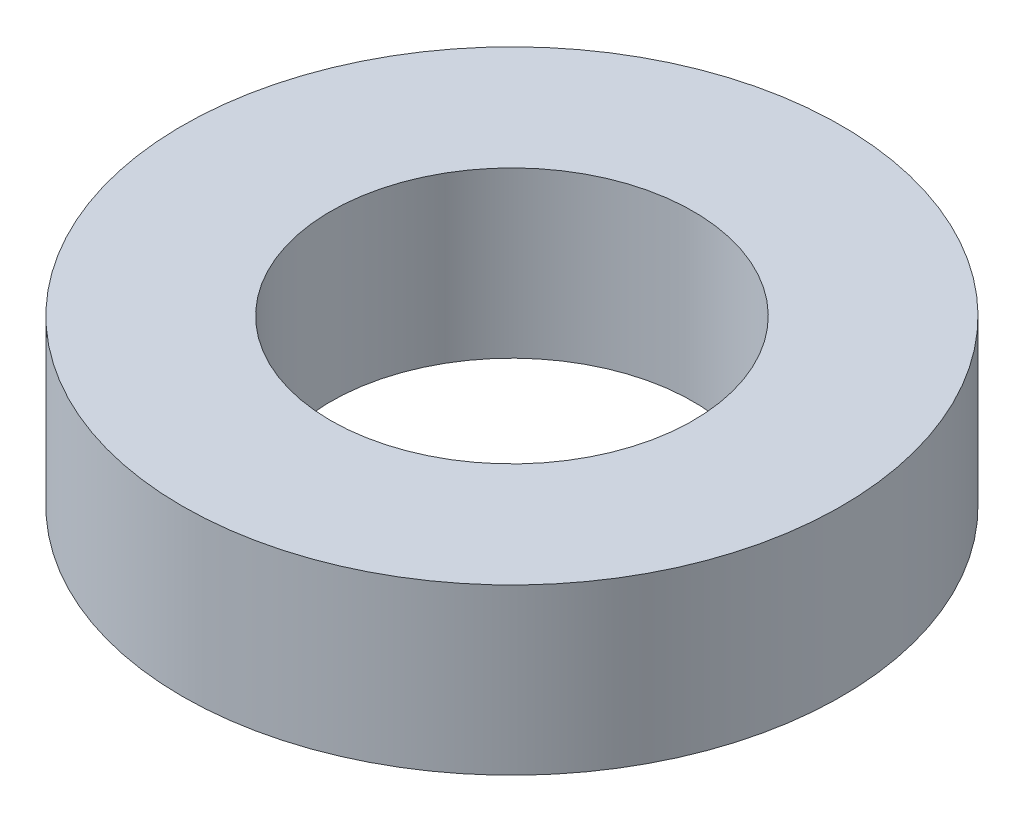
ISO-10303-21;
HEADER;
FILE_DESCRIPTION(('STEP AP214'),'2;1');
FILE_NAME('part.step','',(''),(''),'','','');
FILE_SCHEMA(('AUTOMOTIVE_DESIGN { 1 0 10303 214 1 1 1 1 }'));
ENDSEC;
DATA;
#1=APPLICATION_CONTEXT('core data for automotive mechanical design processes');
#2=APPLICATION_PROTOCOL_DEFINITION('international standard','automotive_design',2000,#1);
#3=PRODUCT_CONTEXT('',#1,'mechanical');
#4=PRODUCT('Part','Part','',(#3));
#5=PRODUCT_RELATED_PRODUCT_CATEGORY('part','',(#4));
#6=PRODUCT_DEFINITION_FORMATION('','',#4);
#7=PRODUCT_DEFINITION_CONTEXT('part definition',#1,'design');
#8=PRODUCT_DEFINITION('design','',#6,#7);
#9=PRODUCT_DEFINITION_SHAPE('','',#8);
#10=(LENGTH_UNIT() NAMED_UNIT(*) SI_UNIT(.MILLI.,.METRE.));
#11=(NAMED_UNIT(*) PLANE_ANGLE_UNIT() SI_UNIT($,.RADIAN.));
#12=(NAMED_UNIT(*) SI_UNIT($,.STERADIAN.) SOLID_ANGLE_UNIT());
#13=UNCERTAINTY_MEASURE_WITH_UNIT(LENGTH_MEASURE(1.E-05),#10,'distance_accuracy_value','');
#14=(GEOMETRIC_REPRESENTATION_CONTEXT(3) GLOBAL_UNCERTAINTY_ASSIGNED_CONTEXT((#13)) GLOBAL_UNIT_ASSIGNED_CONTEXT((#10,
#11,#12)) REPRESENTATION_CONTEXT('',''));
#15=CARTESIAN_POINT('',(0.,0.,0.));
#16=DIRECTION('',(0.,0.,1.));
#17=DIRECTION('',(1.,0.,0.));
#18=AXIS2_PLACEMENT_3D('',#15,#16,#17);
#19=CARTESIAN_POINT('',(0.,1.5,0.));
#20=DIRECTION('',(0.,1.,0.));
#21=DIRECTION('',(0.,0.,1.));
#22=AXIS2_PLACEMENT_3D('',#19,#20,#21);
#23=PLANE('',#22);
#24=CARTESIAN_POINT('',(0.,1.5,0.));
#25=DIRECTION('',(0.,1.,0.));
#26=DIRECTION('',(0.,0.,1.));
#27=AXIS2_PLACEMENT_3D('',#24,#25,#26);
#28=CIRCLE('',#27,3.);
#29=CARTESIAN_POINT('',(0.,1.5,3.));
#30=VERTEX_POINT('',#29);
#31=EDGE_CURVE('E10',#30,#30,#28,.T.);
#32=ORIENTED_EDGE('',*,*,#31,.T.);
#33=EDGE_LOOP('',(#32));
#34=FACE_BOUND('',#33,.T.);
#35=CARTESIAN_POINT('',(0.,1.5,0.));
#36=DIRECTION('',(0.,1.,0.));
#37=DIRECTION('',(0.,0.,1.));
#38=AXIS2_PLACEMENT_3D('',#35,#36,#37);
#39=CIRCLE('',#38,1.65);
#40=CARTESIAN_POINT('',(0.,1.5,1.65));
#41=VERTEX_POINT('',#40);
#42=EDGE_CURVE('E44',#41,#41,#39,.T.);
#43=ORIENTED_EDGE('',*,*,#42,.F.);
#44=EDGE_LOOP('',(#43));
#45=FACE_BOUND('',#44,.T.);
#46=ADVANCED_FACE('F33',(#34,#45),#23,.T.);
#47=CARTESIAN_POINT('',(0.,0.,0.));
#48=DIRECTION('',(0.,1.,0.));
#49=DIRECTION('',(0.,0.,1.));
#50=AXIS2_PLACEMENT_3D('',#47,#48,#49);
#51=PLANE('',#50);
#52=CARTESIAN_POINT('',(0.,0.,0.));
#53=DIRECTION('',(0.,1.,0.));
#54=DIRECTION('',(0.,0.,1.));
#55=AXIS2_PLACEMENT_3D('',#52,#53,#54);
#56=CIRCLE('',#55,3.);
#57=CARTESIAN_POINT('',(0.,0.,3.));
#58=VERTEX_POINT('',#57);
#59=EDGE_CURVE('E37',#58,#58,#56,.T.);
#60=ORIENTED_EDGE('',*,*,#59,.F.);
#61=EDGE_LOOP('',(#60));
#62=FACE_BOUND('',#61,.T.);
#63=CARTESIAN_POINT('',(0.,0.,0.));
#64=DIRECTION('',(0.,1.,0.));
#65=DIRECTION('',(0.,0.,1.));
#66=AXIS2_PLACEMENT_3D('',#63,#64,#65);
#67=CIRCLE('',#66,1.65);
#68=CARTESIAN_POINT('',(0.,0.,1.65));
#69=VERTEX_POINT('',#68);
#70=EDGE_CURVE('E46',#69,#69,#67,.T.);
#71=ORIENTED_EDGE('',*,*,#70,.T.);
#72=EDGE_LOOP('',(#71));
#73=FACE_BOUND('',#72,.T.);
#74=ADVANCED_FACE('F56',(#62,#73),#51,.F.);
#75=CARTESIAN_POINT('',(0.,1.5,0.));
#76=DIRECTION('',(0.,-1.,0.));
#77=DIRECTION('',(0.,0.,-1.));
#78=AXIS2_PLACEMENT_3D('',#75,#76,#77);
#79=CYLINDRICAL_SURFACE('',#78,3.);
#80=ORIENTED_EDGE('',*,*,#31,.F.);
#81=EDGE_LOOP('',(#80));
#82=FACE_BOUND('',#81,.T.);
#83=ORIENTED_EDGE('',*,*,#59,.T.);
#84=EDGE_LOOP('',(#83));
#85=FACE_BOUND('',#84,.T.);
#86=ADVANCED_FACE('F35',(#82,#85),#79,.T.);
#87=CARTESIAN_POINT('',(0.,1.5,0.));
#88=DIRECTION('',(0.,-1.,0.));
#89=DIRECTION('',(0.,0.,-1.));
#90=AXIS2_PLACEMENT_3D('',#87,#88,#89);
#91=CYLINDRICAL_SURFACE('',#90,1.65);
#92=ORIENTED_EDGE('',*,*,#42,.T.);
#93=EDGE_LOOP('',(#92));
#94=FACE_BOUND('',#93,.T.);
#95=ORIENTED_EDGE('',*,*,#70,.F.);
#96=EDGE_LOOP('',(#95));
#97=FACE_BOUND('',#96,.T.);
#98=ADVANCED_FACE('F52',(#94,#97),#91,.F.);
#99=CLOSED_SHELL('',(#46,#74,#86,#98));
#100=MANIFOLD_SOLID_BREP('B2',#99);
#101=ADVANCED_BREP_SHAPE_REPRESENTATION('',(#18,#100),#14);
#102=SHAPE_DEFINITION_REPRESENTATION(#9,#101);
ENDSEC;
END-ISO-10303-21;
